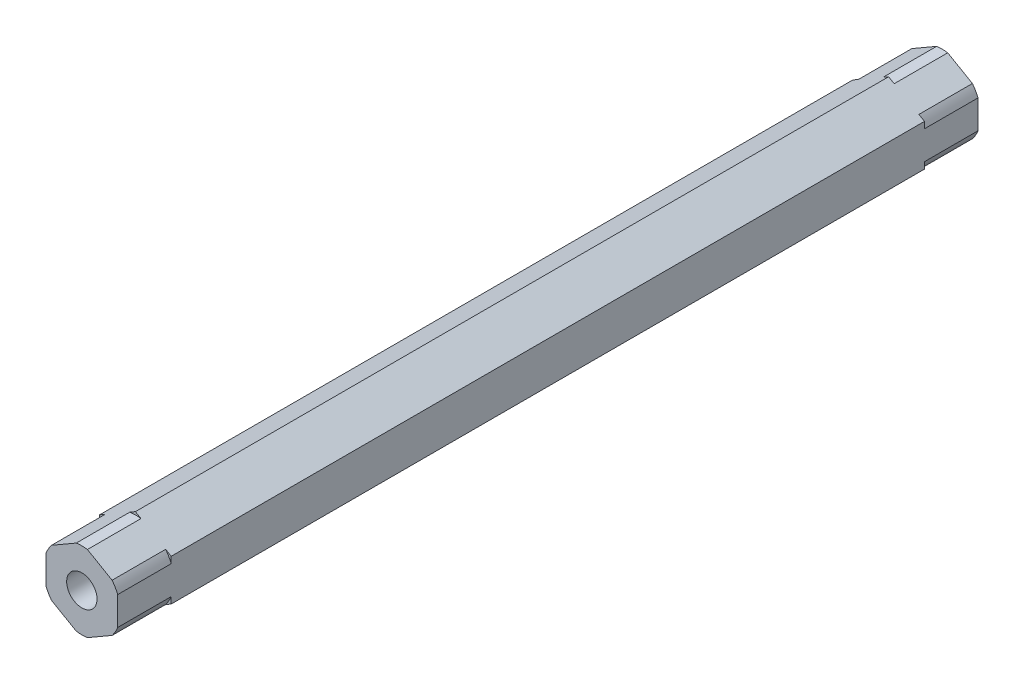
ISO-10303-21;
HEADER;
FILE_DESCRIPTION(('STEP AP214'),'2;1');
FILE_NAME('part.step','',(''),(''),'','','');
FILE_SCHEMA(('AUTOMOTIVE_DESIGN { 1 0 10303 214 1 1 1 1 }'));
ENDSEC;
DATA;
#1=APPLICATION_CONTEXT('core data for automotive mechanical design processes');
#2=APPLICATION_PROTOCOL_DEFINITION('international standard','automotive_design',2000,#1);
#3=PRODUCT_CONTEXT('',#1,'mechanical');
#4=PRODUCT('Part','Part','',(#3));
#5=PRODUCT_RELATED_PRODUCT_CATEGORY('part','',(#4));
#6=PRODUCT_DEFINITION_FORMATION('','',#4);
#7=PRODUCT_DEFINITION_CONTEXT('part definition',#1,'design');
#8=PRODUCT_DEFINITION('design','',#6,#7);
#9=PRODUCT_DEFINITION_SHAPE('','',#8);
#10=(LENGTH_UNIT() NAMED_UNIT(*) SI_UNIT(.MILLI.,.METRE.));
#11=(NAMED_UNIT(*) PLANE_ANGLE_UNIT() SI_UNIT($,.RADIAN.));
#12=(NAMED_UNIT(*) SI_UNIT($,.STERADIAN.) SOLID_ANGLE_UNIT());
#13=UNCERTAINTY_MEASURE_WITH_UNIT(LENGTH_MEASURE(1.E-05),#10,'distance_accuracy_value','');
#14=(GEOMETRIC_REPRESENTATION_CONTEXT(3) GLOBAL_UNCERTAINTY_ASSIGNED_CONTEXT((#13)) GLOBAL_UNIT_ASSIGNED_CONTEXT((#10,
#11,#12)) REPRESENTATION_CONTEXT('',''));
#15=CARTESIAN_POINT('',(0.,0.,0.));
#16=DIRECTION('',(0.,0.,1.));
#17=DIRECTION('',(1.,0.,0.));
#18=AXIS2_PLACEMENT_3D('',#15,#16,#17);
#19=CARTESIAN_POINT('',(2.38125,-4.12444598552339,57.15));
#20=DIRECTION('',(-0.500000000000001,0.866025403784438,0.));
#21=DIRECTION('',(-0.866025403784438,-0.500000000000001,0.));
#22=AXIS2_PLACEMENT_3D('',#19,#20,#21);
#23=PLANE('',#22);
#24=DIRECTION('',(-0.866025403784438,-0.500000000000001,0.));
#25=VECTOR('',#24,1.);
#26=CARTESIAN_POINT('',(2.38125,-4.12444598552339,-50.038));
#27=LINE('',#26,#25);
#28=CARTESIAN_POINT('',(4.7625,-2.74963065701559,-50.038));
#29=VERTEX_POINT('',#28);
#30=CARTESIAN_POINT('',(4.02081215572939,-3.1778443335599,-50.038));
#31=VERTEX_POINT('',#30);
#32=EDGE_CURVE('E270',#29,#31,#27,.T.);
#33=ORIENTED_EDGE('',*,*,#32,.F.);
#34=DIRECTION('',(0.,0.,-1.));
#35=VECTOR('',#34,1.);
#36=CARTESIAN_POINT('',(4.7625,-2.74963065701559,57.15));
#37=LINE('',#36,#35);
#38=CARTESIAN_POINT('',(4.7625,-2.74963065701559,50.038));
#39=VERTEX_POINT('',#38);
#40=EDGE_CURVE('E383',#39,#29,#37,.T.);
#41=ORIENTED_EDGE('',*,*,#40,.F.);
#42=DIRECTION('',(0.866025403784438,0.500000000000001,0.));
#43=VECTOR('',#42,1.);
#44=CARTESIAN_POINT('',(2.38125,-4.12444598552339,50.038));
#45=LINE('',#44,#43);
#46=CARTESIAN_POINT('',(4.02081215572939,-3.1778443335599,50.038));
#47=VERTEX_POINT('',#46);
#48=EDGE_CURVE('E311',#47,#39,#45,.T.);
#49=ORIENTED_EDGE('',*,*,#48,.F.);
#50=DIRECTION('',(0.,0.,1.));
#51=VECTOR('',#50,1.);
#52=CARTESIAN_POINT('',(4.02081215572939,-3.1778443335599,50.038));
#53=LINE('',#52,#51);
#54=CARTESIAN_POINT('',(4.02081215572939,-3.1778443335599,57.15));
#55=VERTEX_POINT('',#54);
#56=EDGE_CURVE('E304',#55,#47,#53,.F.);
#57=ORIENTED_EDGE('',*,*,#56,.F.);
#58=DIRECTION('',(0.866025403784438,0.500000000000001,0.));
#59=VECTOR('',#58,1.);
#60=CARTESIAN_POINT('',(2.38125,-4.12444598552339,57.15));
#61=LINE('',#60,#59);
#62=CARTESIAN_POINT('',(0.741687844270614,-5.07104763748687,57.15));
#63=VERTEX_POINT('',#62);
#64=EDGE_CURVE('E336',#63,#55,#61,.T.);
#65=ORIENTED_EDGE('',*,*,#64,.F.);
#66=DIRECTION('',(0.,0.,1.));
#67=VECTOR('',#66,1.);
#68=CARTESIAN_POINT('',(0.741687844270614,-5.07104763748687,50.038));
#69=LINE('',#68,#67);
#70=CARTESIAN_POINT('',(0.741687844270614,-5.07104763748687,50.038));
#71=VERTEX_POINT('',#70);
#72=EDGE_CURVE('E306',#71,#63,#69,.T.);
#73=ORIENTED_EDGE('',*,*,#72,.F.);
#74=CARTESIAN_POINT('',(0.,-5.49926131403119,50.038));
#75=VERTEX_POINT('',#74);
#76=EDGE_CURVE('E308',#75,#71,#45,.T.);
#77=ORIENTED_EDGE('',*,*,#76,.F.);
#78=DIRECTION('',(0.,0.,-1.));
#79=VECTOR('',#78,1.);
#80=CARTESIAN_POINT('',(0.,-5.49926131403119,57.15));
#81=LINE('',#80,#79);
#82=CARTESIAN_POINT('',(0.,-5.49926131403119,-50.038));
#83=VERTEX_POINT('',#82);
#84=EDGE_CURVE('E355',#75,#83,#81,.T.);
#85=ORIENTED_EDGE('',*,*,#84,.T.);
#86=CARTESIAN_POINT('',(0.741687844270614,-5.07104763748687,-50.038));
#87=VERTEX_POINT('',#86);
#88=EDGE_CURVE('E267',#87,#83,#27,.T.);
#89=ORIENTED_EDGE('',*,*,#88,.F.);
#90=DIRECTION('',(0.,0.,-1.));
#91=VECTOR('',#90,1.);
#92=CARTESIAN_POINT('',(0.741687844270614,-5.07104763748687,-50.038));
#93=LINE('',#92,#91);
#94=CARTESIAN_POINT('',(0.741687844270614,-5.07104763748687,-57.15));
#95=VERTEX_POINT('',#94);
#96=EDGE_CURVE('E254',#87,#95,#93,.T.);
#97=ORIENTED_EDGE('',*,*,#96,.T.);
#98=DIRECTION('',(0.866025403784438,0.500000000000001,0.));
#99=VECTOR('',#98,1.);
#100=CARTESIAN_POINT('',(2.38125,-4.12444598552339,-57.15));
#101=LINE('',#100,#99);
#102=CARTESIAN_POINT('',(4.02081215572939,-3.1778443335599,-57.15));
#103=VERTEX_POINT('',#102);
#104=EDGE_CURVE('E333',#95,#103,#101,.T.);
#105=ORIENTED_EDGE('',*,*,#104,.T.);
#106=DIRECTION('',(0.,0.,-1.));
#107=VECTOR('',#106,1.);
#108=CARTESIAN_POINT('',(4.02081215572939,-3.1778443335599,-50.038));
#109=LINE('',#108,#107);
#110=EDGE_CURVE('E258',#103,#31,#109,.F.);
#111=ORIENTED_EDGE('',*,*,#110,.T.);
#112=EDGE_LOOP('',(#33,#41,#49,#57,#65,#73,#77,#85,#89,#97,#105,#111));
#113=FACE_BOUND('',#112,.T.);
#114=ADVANCED_FACE('F35',(#113),#23,.F.);
#115=CARTESIAN_POINT('',(4.7625,0.,57.15));
#116=DIRECTION('',(-1.,0.,0.));
#117=DIRECTION('',(0.,-1.,0.));
#118=AXIS2_PLACEMENT_3D('',#115,#116,#117);
#119=PLANE('',#118);
#120=DIRECTION('',(0.,-1.,0.));
#121=VECTOR('',#120,1.);
#122=CARTESIAN_POINT('',(4.7625,0.,-50.038));
#123=LINE('',#122,#121);
#124=CARTESIAN_POINT('',(4.7625,2.7496306570156,-50.038));
#125=VERTEX_POINT('',#124);
#126=CARTESIAN_POINT('',(4.7625,1.89320330392698,-50.038));
#127=VERTEX_POINT('',#126);
#128=EDGE_CURVE('E232',#125,#127,#123,.T.);
#129=ORIENTED_EDGE('',*,*,#128,.F.);
#130=DIRECTION('',(0.,0.,-1.));
#131=VECTOR('',#130,1.);
#132=CARTESIAN_POINT('',(4.7625,2.7496306570156,57.15));
#133=LINE('',#132,#131);
#134=CARTESIAN_POINT('',(4.7625,2.7496306570156,50.038));
#135=VERTEX_POINT('',#134);
#136=EDGE_CURVE('E381',#135,#125,#133,.T.);
#137=ORIENTED_EDGE('',*,*,#136,.F.);
#138=DIRECTION('',(0.,1.,0.));
#139=VECTOR('',#138,1.);
#140=CARTESIAN_POINT('',(4.7625,0.,50.038));
#141=LINE('',#140,#139);
#142=CARTESIAN_POINT('',(4.7625,1.89320330392698,50.038));
#143=VERTEX_POINT('',#142);
#144=EDGE_CURVE('E320',#143,#135,#141,.T.);
#145=ORIENTED_EDGE('',*,*,#144,.F.);
#146=DIRECTION('',(0.,0.,1.));
#147=VECTOR('',#146,1.);
#148=CARTESIAN_POINT('',(4.7625,1.89320330392698,50.038));
#149=LINE('',#148,#147);
#150=CARTESIAN_POINT('',(4.7625,1.89320330392698,57.15));
#151=VERTEX_POINT('',#150);
#152=EDGE_CURVE('E300',#151,#143,#149,.F.);
#153=ORIENTED_EDGE('',*,*,#152,.F.);
#154=DIRECTION('',(0.,1.,0.));
#155=VECTOR('',#154,1.);
#156=CARTESIAN_POINT('',(4.7625,0.,57.15));
#157=LINE('',#156,#155);
#158=CARTESIAN_POINT('',(4.7625,-1.89320330392697,57.15));
#159=VERTEX_POINT('',#158);
#160=EDGE_CURVE('E339',#159,#151,#157,.T.);
#161=ORIENTED_EDGE('',*,*,#160,.F.);
#162=DIRECTION('',(0.,0.,1.));
#163=VECTOR('',#162,1.);
#164=CARTESIAN_POINT('',(4.7625,-1.89320330392697,50.038));
#165=LINE('',#164,#163);
#166=CARTESIAN_POINT('',(4.7625,-1.89320330392697,50.038));
#167=VERTEX_POINT('',#166);
#168=EDGE_CURVE('E302',#167,#159,#165,.T.);
#169=ORIENTED_EDGE('',*,*,#168,.F.);
#170=EDGE_CURVE('E322',#39,#167,#141,.T.);
#171=ORIENTED_EDGE('',*,*,#170,.F.);
#172=ORIENTED_EDGE('',*,*,#40,.T.);
#173=CARTESIAN_POINT('',(4.7625,-1.89320330392697,-50.038));
#174=VERTEX_POINT('',#173);
#175=EDGE_CURVE('E240',#174,#29,#123,.T.);
#176=ORIENTED_EDGE('',*,*,#175,.F.);
#177=DIRECTION('',(0.,0.,-1.));
#178=VECTOR('',#177,1.);
#179=CARTESIAN_POINT('',(4.7625,-1.89320330392697,-50.038));
#180=LINE('',#179,#178);
#181=CARTESIAN_POINT('',(4.7625,-1.89320330392697,-57.15));
#182=VERTEX_POINT('',#181);
#183=EDGE_CURVE('E255',#174,#182,#180,.T.);
#184=ORIENTED_EDGE('',*,*,#183,.T.);
#185=DIRECTION('',(0.,1.,0.));
#186=VECTOR('',#185,1.);
#187=CARTESIAN_POINT('',(4.7625,0.,-57.15));
#188=LINE('',#187,#186);
#189=CARTESIAN_POINT('',(4.7625,1.89320330392698,-57.15));
#190=VERTEX_POINT('',#189);
#191=EDGE_CURVE('E253',#182,#190,#188,.T.);
#192=ORIENTED_EDGE('',*,*,#191,.T.);
#193=DIRECTION('',(0.,0.,-1.));
#194=VECTOR('',#193,1.);
#195=CARTESIAN_POINT('',(4.7625,1.89320330392698,-50.038));
#196=LINE('',#195,#194);
#197=EDGE_CURVE('E49',#190,#127,#196,.F.);
#198=ORIENTED_EDGE('',*,*,#197,.T.);
#199=EDGE_LOOP('',(#129,#137,#145,#153,#161,#169,#171,#172,#176,#184,#192,#198));
#200=FACE_BOUND('',#199,.T.);
#201=ADVANCED_FACE('F250',(#200),#119,.F.);
#202=CARTESIAN_POINT('',(2.38125,4.12444598552339,57.15));
#203=DIRECTION('',(-0.5,-0.866025403784439,0.));
#204=DIRECTION('',(0.866025403784439,-0.5,0.));
#205=AXIS2_PLACEMENT_3D('',#202,#203,#204);
#206=PLANE('',#205);
#207=DIRECTION('',(0.866025403784439,-0.5,0.));
#208=VECTOR('',#207,1.);
#209=CARTESIAN_POINT('',(2.38125,4.12444598552339,-50.038));
#210=LINE('',#209,#208);
#211=CARTESIAN_POINT('',(0.,5.49926131403118,-50.038));
#212=VERTEX_POINT('',#211);
#213=CARTESIAN_POINT('',(0.741687844270607,5.07104763748687,-50.038));
#214=VERTEX_POINT('',#213);
#215=EDGE_CURVE('E274',#212,#214,#210,.T.);
#216=ORIENTED_EDGE('',*,*,#215,.F.);
#217=DIRECTION('',(0.,0.,-1.));
#218=VECTOR('',#217,1.);
#219=CARTESIAN_POINT('',(0.,5.49926131403119,57.15));
#220=LINE('',#219,#218);
#221=CARTESIAN_POINT('',(0.,5.49926131403118,50.038));
#222=VERTEX_POINT('',#221);
#223=EDGE_CURVE('E378',#222,#212,#220,.T.);
#224=ORIENTED_EDGE('',*,*,#223,.F.);
#225=DIRECTION('',(-0.866025403784439,0.5,0.));
#226=VECTOR('',#225,1.);
#227=CARTESIAN_POINT('',(2.38125,4.12444598552339,50.038));
#228=LINE('',#227,#226);
#229=CARTESIAN_POINT('',(0.741687844270607,5.07104763748687,50.038));
#230=VERTEX_POINT('',#229);
#231=EDGE_CURVE('E317',#230,#222,#228,.T.);
#232=ORIENTED_EDGE('',*,*,#231,.F.);
#233=DIRECTION('',(0.,0.,1.));
#234=VECTOR('',#233,1.);
#235=CARTESIAN_POINT('',(0.741687844270607,5.07104763748687,50.038));
#236=LINE('',#235,#234);
#237=CARTESIAN_POINT('',(0.741687844270609,5.07104763748687,57.15));
#238=VERTEX_POINT('',#237);
#239=EDGE_CURVE('E296',#238,#230,#236,.F.);
#240=ORIENTED_EDGE('',*,*,#239,.F.);
#241=DIRECTION('',(-0.866025403784439,0.5,0.));
#242=VECTOR('',#241,1.);
#243=CARTESIAN_POINT('',(2.38125,4.12444598552339,57.15));
#244=LINE('',#243,#242);
#245=CARTESIAN_POINT('',(4.02081215572939,3.17784433355991,57.15));
#246=VERTEX_POINT('',#245);
#247=EDGE_CURVE('E343',#246,#238,#244,.T.);
#248=ORIENTED_EDGE('',*,*,#247,.F.);
#249=DIRECTION('',(0.,0.,1.));
#250=VECTOR('',#249,1.);
#251=CARTESIAN_POINT('',(4.02081215572939,3.1778443335599,50.038));
#252=LINE('',#251,#250);
#253=CARTESIAN_POINT('',(4.02081215572939,3.1778443335599,50.038));
#254=VERTEX_POINT('',#253);
#255=EDGE_CURVE('E298',#254,#246,#252,.T.);
#256=ORIENTED_EDGE('',*,*,#255,.F.);
#257=EDGE_CURVE('E319',#135,#254,#228,.T.);
#258=ORIENTED_EDGE('',*,*,#257,.F.);
#259=ORIENTED_EDGE('',*,*,#136,.T.);
#260=CARTESIAN_POINT('',(4.02081215572939,3.1778443335599,-50.038));
#261=VERTEX_POINT('',#260);
#262=EDGE_CURVE('E236',#261,#125,#210,.T.);
#263=ORIENTED_EDGE('',*,*,#262,.F.);
#264=DIRECTION('',(0.,0.,-1.));
#265=VECTOR('',#264,1.);
#266=CARTESIAN_POINT('',(4.02081215572939,3.1778443335599,-50.038));
#267=LINE('',#266,#265);
#268=CARTESIAN_POINT('',(4.02081215572939,3.17784433355991,-57.15));
#269=VERTEX_POINT('',#268);
#270=EDGE_CURVE('E244',#261,#269,#267,.T.);
#271=ORIENTED_EDGE('',*,*,#270,.T.);
#272=DIRECTION('',(-0.866025403784439,0.5,0.));
#273=VECTOR('',#272,1.);
#274=CARTESIAN_POINT('',(2.38125,4.12444598552339,-57.15));
#275=LINE('',#274,#273);
#276=CARTESIAN_POINT('',(0.741687844270609,5.07104763748687,-57.15));
#277=VERTEX_POINT('',#276);
#278=EDGE_CURVE('E359',#269,#277,#275,.T.);
#279=ORIENTED_EDGE('',*,*,#278,.T.);
#280=DIRECTION('',(0.,0.,-1.));
#281=VECTOR('',#280,1.);
#282=CARTESIAN_POINT('',(0.741687844270607,5.07104763748687,-50.038));
#283=LINE('',#282,#281);
#284=EDGE_CURVE('E57',#277,#214,#283,.F.);
#285=ORIENTED_EDGE('',*,*,#284,.T.);
#286=EDGE_LOOP('',(#216,#224,#232,#240,#248,#256,#258,#259,#263,#271,#279,#285));
#287=FACE_BOUND('',#286,.T.);
#288=ADVANCED_FACE('F464',(#287),#206,.F.);
#289=CARTESIAN_POINT('',(-2.38125,4.12444598552339,57.15));
#290=DIRECTION('',(0.5,-0.866025403784438,0.));
#291=DIRECTION('',(0.866025403784439,0.5,0.));
#292=AXIS2_PLACEMENT_3D('',#289,#290,#291);
#293=PLANE('',#292);
#294=DIRECTION('',(0.866025403784439,0.5,0.));
#295=VECTOR('',#294,1.);
#296=CARTESIAN_POINT('',(-2.38125,4.12444598552339,-50.038));
#297=LINE('',#296,#295);
#298=CARTESIAN_POINT('',(-4.7625,2.74963065701559,-50.038));
#299=VERTEX_POINT('',#298);
#300=CARTESIAN_POINT('',(-4.02081215572939,3.1778443335599,-50.038));
#301=VERTEX_POINT('',#300);
#302=EDGE_CURVE('E271',#299,#301,#297,.T.);
#303=ORIENTED_EDGE('',*,*,#302,.F.);
#304=DIRECTION('',(0.,0.,-1.));
#305=VECTOR('',#304,1.);
#306=CARTESIAN_POINT('',(-4.7625,2.74963065701559,57.15));
#307=LINE('',#306,#305);
#308=CARTESIAN_POINT('',(-4.7625,2.74963065701559,50.038));
#309=VERTEX_POINT('',#308);
#310=EDGE_CURVE('E375',#309,#299,#307,.T.);
#311=ORIENTED_EDGE('',*,*,#310,.F.);
#312=DIRECTION('',(-0.866025403784439,-0.5,0.));
#313=VECTOR('',#312,1.);
#314=CARTESIAN_POINT('',(-2.38125,4.12444598552339,50.038));
#315=LINE('',#314,#313);
#316=CARTESIAN_POINT('',(-4.02081215572939,3.1778443335599,50.038));
#317=VERTEX_POINT('',#316);
#318=EDGE_CURVE('E314',#317,#309,#315,.T.);
#319=ORIENTED_EDGE('',*,*,#318,.F.);
#320=DIRECTION('',(0.,0.,1.));
#321=VECTOR('',#320,1.);
#322=CARTESIAN_POINT('',(-4.02081215572939,3.1778443335599,50.038));
#323=LINE('',#322,#321);
#324=CARTESIAN_POINT('',(-4.02081215572939,3.1778443335599,57.15));
#325=VERTEX_POINT('',#324);
#326=EDGE_CURVE('E292',#325,#317,#323,.F.);
#327=ORIENTED_EDGE('',*,*,#326,.F.);
#328=DIRECTION('',(-0.866025403784438,-0.5,0.));
#329=VECTOR('',#328,1.);
#330=CARTESIAN_POINT('',(-2.38125,4.12444598552339,57.15));
#331=LINE('',#330,#329);
#332=CARTESIAN_POINT('',(-0.741687844270611,5.07104763748687,57.15));
#333=VERTEX_POINT('',#332);
#334=EDGE_CURVE('E346',#333,#325,#331,.T.);
#335=ORIENTED_EDGE('',*,*,#334,.F.);
#336=DIRECTION('',(0.,0.,1.));
#337=VECTOR('',#336,1.);
#338=CARTESIAN_POINT('',(-0.741687844270608,5.07104763748687,50.038));
#339=LINE('',#338,#337);
#340=CARTESIAN_POINT('',(-0.741687844270608,5.07104763748687,50.038));
#341=VERTEX_POINT('',#340);
#342=EDGE_CURVE('E294',#341,#333,#339,.T.);
#343=ORIENTED_EDGE('',*,*,#342,.F.);
#344=EDGE_CURVE('E316',#222,#341,#315,.T.);
#345=ORIENTED_EDGE('',*,*,#344,.F.);
#346=ORIENTED_EDGE('',*,*,#223,.T.);
#347=CARTESIAN_POINT('',(-0.741687844270608,5.07104763748687,-50.038));
#348=VERTEX_POINT('',#347);
#349=EDGE_CURVE('E273',#348,#212,#297,.T.);
#350=ORIENTED_EDGE('',*,*,#349,.F.);
#351=DIRECTION('',(0.,0.,-1.));
#352=VECTOR('',#351,1.);
#353=CARTESIAN_POINT('',(-0.741687844270608,5.07104763748687,-50.038));
#354=LINE('',#353,#352);
#355=CARTESIAN_POINT('',(-0.741687844270611,5.07104763748687,-57.15));
#356=VERTEX_POINT('',#355);
#357=EDGE_CURVE('E467',#348,#356,#354,.T.);
#358=ORIENTED_EDGE('',*,*,#357,.T.);
#359=DIRECTION('',(-0.866025403784438,-0.5,0.));
#360=VECTOR('',#359,1.);
#361=CARTESIAN_POINT('',(-2.38125,4.12444598552339,-57.15));
#362=LINE('',#361,#360);
#363=CARTESIAN_POINT('',(-4.02081215572939,3.1778443335599,-57.15));
#364=VERTEX_POINT('',#363);
#365=EDGE_CURVE('E362',#356,#364,#362,.T.);
#366=ORIENTED_EDGE('',*,*,#365,.T.);
#367=DIRECTION('',(0.,0.,-1.));
#368=VECTOR('',#367,1.);
#369=CARTESIAN_POINT('',(-4.02081215572939,3.1778443335599,-50.038));
#370=LINE('',#369,#368);
#371=EDGE_CURVE('E489',#364,#301,#370,.F.);
#372=ORIENTED_EDGE('',*,*,#371,.T.);
#373=EDGE_LOOP('',(#303,#311,#319,#327,#335,#343,#345,#346,#350,#358,#366,#372));
#374=FACE_BOUND('',#373,.T.);
#375=ADVANCED_FACE('F443',(#374),#293,.F.);
#376=CARTESIAN_POINT('',(-4.7625,0.,57.15));
#377=DIRECTION('',(1.,0.,0.));
#378=DIRECTION('',(0.,1.,0.));
#379=AXIS2_PLACEMENT_3D('',#376,#377,#378);
#380=PLANE('',#379);
#381=DIRECTION('',(0.,1.,0.));
#382=VECTOR('',#381,1.);
#383=CARTESIAN_POINT('',(-4.7625,0.,-50.038));
#384=LINE('',#383,#382);
#385=CARTESIAN_POINT('',(-4.7625,-2.7496306570156,-50.038));
#386=VERTEX_POINT('',#385);
#387=CARTESIAN_POINT('',(-4.7625,-1.89320330392697,-50.038));
#388=VERTEX_POINT('',#387);
#389=EDGE_CURVE('E265',#386,#388,#384,.T.);
#390=ORIENTED_EDGE('',*,*,#389,.F.);
#391=DIRECTION('',(0.,0.,-1.));
#392=VECTOR('',#391,1.);
#393=CARTESIAN_POINT('',(-4.7625,-2.7496306570156,57.15));
#394=LINE('',#393,#392);
#395=CARTESIAN_POINT('',(-4.7625,-2.7496306570156,50.038));
#396=VERTEX_POINT('',#395);
#397=EDGE_CURVE('E372',#396,#386,#394,.T.);
#398=ORIENTED_EDGE('',*,*,#397,.F.);
#399=DIRECTION('',(0.,-1.,0.));
#400=VECTOR('',#399,1.);
#401=CARTESIAN_POINT('',(-4.7625,0.,50.038));
#402=LINE('',#401,#400);
#403=CARTESIAN_POINT('',(-4.7625,-1.89320330392697,50.038));
#404=VERTEX_POINT('',#403);
#405=EDGE_CURVE('E310',#404,#396,#402,.T.);
#406=ORIENTED_EDGE('',*,*,#405,.F.);
#407=DIRECTION('',(0.,0.,1.));
#408=VECTOR('',#407,1.);
#409=CARTESIAN_POINT('',(-4.7625,-1.89320330392697,50.038));
#410=LINE('',#409,#408);
#411=CARTESIAN_POINT('',(-4.7625,-1.89320330392697,57.15));
#412=VERTEX_POINT('',#411);
#413=EDGE_CURVE('E288',#412,#404,#410,.F.);
#414=ORIENTED_EDGE('',*,*,#413,.F.);
#415=DIRECTION('',(0.,-1.,0.));
#416=VECTOR('',#415,1.);
#417=CARTESIAN_POINT('',(-4.7625,0.,57.15));
#418=LINE('',#417,#416);
#419=CARTESIAN_POINT('',(-4.7625,1.89320330392697,57.15));
#420=VERTEX_POINT('',#419);
#421=EDGE_CURVE('E349',#420,#412,#418,.T.);
#422=ORIENTED_EDGE('',*,*,#421,.F.);
#423=DIRECTION('',(0.,0.,1.));
#424=VECTOR('',#423,1.);
#425=CARTESIAN_POINT('',(-4.7625,1.89320330392697,50.038));
#426=LINE('',#425,#424);
#427=CARTESIAN_POINT('',(-4.7625,1.89320330392697,50.038));
#428=VERTEX_POINT('',#427);
#429=EDGE_CURVE('E290',#428,#420,#426,.T.);
#430=ORIENTED_EDGE('',*,*,#429,.F.);
#431=EDGE_CURVE('E313',#309,#428,#402,.T.);
#432=ORIENTED_EDGE('',*,*,#431,.F.);
#433=ORIENTED_EDGE('',*,*,#310,.T.);
#434=CARTESIAN_POINT('',(-4.7625,1.89320330392697,-50.038));
#435=VERTEX_POINT('',#434);
#436=EDGE_CURVE('E268',#435,#299,#384,.T.);
#437=ORIENTED_EDGE('',*,*,#436,.F.);
#438=DIRECTION('',(0.,0.,-1.));
#439=VECTOR('',#438,1.);
#440=CARTESIAN_POINT('',(-4.7625,1.89320330392697,-50.038));
#441=LINE('',#440,#439);
#442=CARTESIAN_POINT('',(-4.7625,1.89320330392697,-57.15));
#443=VERTEX_POINT('',#442);
#444=EDGE_CURVE('E482',#435,#443,#441,.T.);
#445=ORIENTED_EDGE('',*,*,#444,.T.);
#446=DIRECTION('',(0.,-1.,0.));
#447=VECTOR('',#446,1.);
#448=CARTESIAN_POINT('',(-4.7625,0.,-57.15));
#449=LINE('',#448,#447);
#450=CARTESIAN_POINT('',(-4.7625,-1.89320330392697,-57.15));
#451=VERTEX_POINT('',#450);
#452=EDGE_CURVE('E365',#443,#451,#449,.T.);
#453=ORIENTED_EDGE('',*,*,#452,.T.);
#454=DIRECTION('',(0.,0.,-1.));
#455=VECTOR('',#454,1.);
#456=CARTESIAN_POINT('',(-4.7625,-1.89320330392697,-50.038));
#457=LINE('',#456,#455);
#458=EDGE_CURVE('E485',#451,#388,#457,.F.);
#459=ORIENTED_EDGE('',*,*,#458,.T.);
#460=EDGE_LOOP('',(#390,#398,#406,#414,#422,#430,#432,#433,#437,#445,#453,#459));
#461=FACE_BOUND('',#460,.T.);
#462=ADVANCED_FACE('F503',(#461),#380,.F.);
#463=CARTESIAN_POINT('',(-2.38125,-4.12444598552339,57.15));
#464=DIRECTION('',(0.5,0.866025403784439,0.));
#465=DIRECTION('',(-0.866025403784439,0.5,0.));
#466=AXIS2_PLACEMENT_3D('',#463,#464,#465);
#467=PLANE('',#466);
#468=DIRECTION('',(-0.866025403784439,0.5,0.));
#469=VECTOR('',#468,1.);
#470=CARTESIAN_POINT('',(-2.38125,-4.12444598552339,-50.038));
#471=LINE('',#470,#469);
#472=CARTESIAN_POINT('',(-0.741687844270613,-5.07104763748687,-50.038));
#473=VERTEX_POINT('',#472);
#474=EDGE_CURVE('E11',#83,#473,#471,.T.);
#475=ORIENTED_EDGE('',*,*,#474,.F.);
#476=ORIENTED_EDGE('',*,*,#84,.F.);
#477=DIRECTION('',(0.866025403784439,-0.5,0.));
#478=VECTOR('',#477,1.);
#479=CARTESIAN_POINT('',(-2.38125,-4.12444598552339,50.038));
#480=LINE('',#479,#478);
#481=CARTESIAN_POINT('',(-0.741687844270613,-5.07104763748687,50.038));
#482=VERTEX_POINT('',#481);
#483=EDGE_CURVE('E391',#482,#75,#480,.T.);
#484=ORIENTED_EDGE('',*,*,#483,.F.);
#485=DIRECTION('',(0.,0.,1.));
#486=VECTOR('',#485,1.);
#487=CARTESIAN_POINT('',(-0.741687844270613,-5.07104763748687,50.038));
#488=LINE('',#487,#486);
#489=CARTESIAN_POINT('',(-0.741687844270615,-5.07104763748687,57.15));
#490=VERTEX_POINT('',#489);
#491=EDGE_CURVE('E279',#490,#482,#488,.F.);
#492=ORIENTED_EDGE('',*,*,#491,.F.);
#493=DIRECTION('',(0.866025403784439,-0.5,0.));
#494=VECTOR('',#493,1.);
#495=CARTESIAN_POINT('',(-2.38125,-4.12444598552339,57.15));
#496=LINE('',#495,#494);
#497=CARTESIAN_POINT('',(-4.02081215572938,-3.17784433355991,57.15));
#498=VERTEX_POINT('',#497);
#499=EDGE_CURVE('E352',#498,#490,#496,.T.);
#500=ORIENTED_EDGE('',*,*,#499,.F.);
#501=DIRECTION('',(0.,0.,1.));
#502=VECTOR('',#501,1.);
#503=CARTESIAN_POINT('',(-4.02081215572938,-3.17784433355991,50.038));
#504=LINE('',#503,#502);
#505=CARTESIAN_POINT('',(-4.02081215572938,-3.17784433355991,50.038));
#506=VERTEX_POINT('',#505);
#507=EDGE_CURVE('E286',#506,#498,#504,.T.);
#508=ORIENTED_EDGE('',*,*,#507,.F.);
#509=EDGE_CURVE('E392',#396,#506,#480,.T.);
#510=ORIENTED_EDGE('',*,*,#509,.F.);
#511=ORIENTED_EDGE('',*,*,#397,.T.);
#512=CARTESIAN_POINT('',(-4.02081215572938,-3.17784433355991,-50.038));
#513=VERTEX_POINT('',#512);
#514=EDGE_CURVE('E38',#513,#386,#471,.T.);
#515=ORIENTED_EDGE('',*,*,#514,.F.);
#516=DIRECTION('',(0.,0.,-1.));
#517=VECTOR('',#516,1.);
#518=CARTESIAN_POINT('',(-4.02081215572938,-3.17784433355991,-50.038));
#519=LINE('',#518,#517);
#520=CARTESIAN_POINT('',(-4.02081215572938,-3.17784433355991,-57.15));
#521=VERTEX_POINT('',#520);
#522=EDGE_CURVE('E245',#513,#521,#519,.T.);
#523=ORIENTED_EDGE('',*,*,#522,.T.);
#524=DIRECTION('',(0.866025403784439,-0.5,0.));
#525=VECTOR('',#524,1.);
#526=CARTESIAN_POINT('',(-2.38125,-4.12444598552339,-57.15));
#527=LINE('',#526,#525);
#528=CARTESIAN_POINT('',(-0.741687844270615,-5.07104763748687,-57.15));
#529=VERTEX_POINT('',#528);
#530=EDGE_CURVE('E340',#521,#529,#527,.T.);
#531=ORIENTED_EDGE('',*,*,#530,.T.);
#532=DIRECTION('',(0.,0.,-1.));
#533=VECTOR('',#532,1.);
#534=CARTESIAN_POINT('',(-0.741687844270613,-5.07104763748687,-50.038));
#535=LINE('',#534,#533);
#536=EDGE_CURVE('E479',#529,#473,#535,.F.);
#537=ORIENTED_EDGE('',*,*,#536,.T.);
#538=EDGE_LOOP('',(#475,#476,#484,#492,#500,#508,#510,#511,#515,#523,#531,#537));
#539=FACE_BOUND('',#538,.T.);
#540=ADVANCED_FACE('F423',(#539),#467,.F.);
#541=CARTESIAN_POINT('',(0.,0.,-57.15));
#542=DIRECTION('',(0.,0.,1.));
#543=DIRECTION('',(1.,0.,0.));
#544=AXIS2_PLACEMENT_3D('',#541,#542,#543);
#545=PLANE('',#544);
#546=CARTESIAN_POINT('',(0.,0.,-57.15));
#547=DIRECTION('',(0.,0.,-1.));
#548=DIRECTION('',(-1.,0.,0.));
#549=AXIS2_PLACEMENT_3D('',#546,#547,#548);
#550=CIRCLE('',#549,2.0193);
#551=CARTESIAN_POINT('',(-2.0193,0.,-57.15));
#552=VERTEX_POINT('',#551);
#553=EDGE_CURVE('E326',#552,#552,#550,.T.);
#554=ORIENTED_EDGE('',*,*,#553,.F.);
#555=EDGE_LOOP('',(#554));
#556=FACE_BOUND('',#555,.T.);
#557=ORIENTED_EDGE('',*,*,#191,.F.);
#558=CARTESIAN_POINT('',(0.,0.,-57.15));
#559=DIRECTION('',(0.,0.,1.));
#560=DIRECTION('',(1.,0.,0.));
#561=AXIS2_PLACEMENT_3D('',#558,#559,#560);
#562=CIRCLE('',#561,5.125);
#563=EDGE_CURVE('E393',#182,#103,#562,.F.);
#564=ORIENTED_EDGE('',*,*,#563,.T.);
#565=ORIENTED_EDGE('',*,*,#104,.F.);
#566=EDGE_CURVE('E395',#95,#529,#562,.F.);
#567=ORIENTED_EDGE('',*,*,#566,.T.);
#568=ORIENTED_EDGE('',*,*,#530,.F.);
#569=EDGE_CURVE('E400',#521,#451,#562,.F.);
#570=ORIENTED_EDGE('',*,*,#569,.T.);
#571=ORIENTED_EDGE('',*,*,#452,.F.);
#572=EDGE_CURVE('E401',#443,#364,#562,.F.);
#573=ORIENTED_EDGE('',*,*,#572,.T.);
#574=ORIENTED_EDGE('',*,*,#365,.F.);
#575=EDGE_CURVE('E396',#356,#277,#562,.F.);
#576=ORIENTED_EDGE('',*,*,#575,.T.);
#577=ORIENTED_EDGE('',*,*,#278,.F.);
#578=CARTESIAN_POINT('',(0.,0.,-57.15));
#579=DIRECTION('',(0.,0.,1.));
#580=DIRECTION('',(1.,0.,0.));
#581=AXIS2_PLACEMENT_3D('',#578,#579,#580);
#582=CIRCLE('',#581,5.125);
#583=EDGE_CURVE('E475',#190,#269,#582,.T.);
#584=ORIENTED_EDGE('',*,*,#583,.F.);
#585=EDGE_LOOP('',(#557,#564,#565,#567,#568,#570,#571,#573,#574,#576,#577,#584));
#586=FACE_BOUND('',#585,.T.);
#587=ADVANCED_FACE('F492',(#556,#586),#545,.F.);
#588=CARTESIAN_POINT('',(0.,0.,57.15));
#589=DIRECTION('',(0.,0.,1.));
#590=DIRECTION('',(1.,0.,0.));
#591=AXIS2_PLACEMENT_3D('',#588,#589,#590);
#592=PLANE('',#591);
#593=CARTESIAN_POINT('',(0.,0.,57.15));
#594=DIRECTION('',(0.,0.,-1.));
#595=DIRECTION('',(-1.,0.,0.));
#596=AXIS2_PLACEMENT_3D('',#593,#594,#595);
#597=CIRCLE('',#596,2.0193);
#598=CARTESIAN_POINT('',(2.0193,0.,57.15));
#599=VERTEX_POINT('',#598);
#600=EDGE_CURVE('E327',#599,#599,#597,.T.);
#601=ORIENTED_EDGE('',*,*,#600,.T.);
#602=EDGE_LOOP('',(#601));
#603=FACE_BOUND('',#602,.T.);
#604=ORIENTED_EDGE('',*,*,#160,.T.);
#605=CARTESIAN_POINT('',(0.,0.,57.15));
#606=DIRECTION('',(0.,0.,1.));
#607=DIRECTION('',(1.,0.,0.));
#608=AXIS2_PLACEMENT_3D('',#605,#606,#607);
#609=CIRCLE('',#608,5.125);
#610=EDGE_CURVE('E282',#151,#246,#609,.T.);
#611=ORIENTED_EDGE('',*,*,#610,.T.);
#612=ORIENTED_EDGE('',*,*,#247,.T.);
#613=CARTESIAN_POINT('',(0.,0.,57.15));
#614=DIRECTION('',(0.,0.,1.));
#615=DIRECTION('',(1.,0.,0.));
#616=AXIS2_PLACEMENT_3D('',#613,#614,#615);
#617=CIRCLE('',#616,5.125);
#618=EDGE_CURVE('E390',#238,#333,#617,.T.);
#619=ORIENTED_EDGE('',*,*,#618,.T.);
#620=ORIENTED_EDGE('',*,*,#334,.T.);
#621=EDGE_CURVE('E433',#325,#420,#617,.T.);
#622=ORIENTED_EDGE('',*,*,#621,.T.);
#623=ORIENTED_EDGE('',*,*,#421,.T.);
#624=EDGE_CURVE('E430',#412,#498,#617,.T.);
#625=ORIENTED_EDGE('',*,*,#624,.T.);
#626=ORIENTED_EDGE('',*,*,#499,.T.);
#627=EDGE_CURVE('E389',#490,#63,#617,.T.);
#628=ORIENTED_EDGE('',*,*,#627,.T.);
#629=ORIENTED_EDGE('',*,*,#64,.T.);
#630=EDGE_CURVE('E386',#55,#159,#617,.T.);
#631=ORIENTED_EDGE('',*,*,#630,.T.);
#632=EDGE_LOOP('',(#604,#611,#612,#619,#620,#622,#623,#625,#626,#628,#629,#631));
#633=FACE_BOUND('',#632,.T.);
#634=ADVANCED_FACE('F428',(#603,#633),#592,.T.);
#635=CARTESIAN_POINT('',(0.,0.,-38.1));
#636=DIRECTION('',(0.,0.,-1.));
#637=DIRECTION('',(-1.,0.,0.));
#638=AXIS2_PLACEMENT_3D('',#635,#636,#637);
#639=CYLINDRICAL_SURFACE('',#638,2.0193);
#640=CARTESIAN_POINT('',(0.,0.,-38.1));
#641=DIRECTION('',(0.,0.,-1.));
#642=DIRECTION('',(-1.,0.,0.));
#643=AXIS2_PLACEMENT_3D('',#640,#641,#642);
#644=CIRCLE('',#643,2.0193);
#645=CARTESIAN_POINT('',(-2.0193,0.,-38.1));
#646=VERTEX_POINT('',#645);
#647=EDGE_CURVE('E330',#646,#646,#644,.T.);
#648=CARTESIAN_POINT('',(-2.0193,0.,-38.1));
#649=CARTESIAN_POINT('',(-2.0193,0.,-38.2984375));
#650=CARTESIAN_POINT('',(-2.0193,0.,-38.496875));
#651=CARTESIAN_POINT('',(-2.0193,0.,-38.89375));
#652=CARTESIAN_POINT('',(-2.0193,0.,-39.0921875));
#653=CARTESIAN_POINT('',(-2.0193,0.,-39.4890625));
#654=CARTESIAN_POINT('',(-2.0193,0.,-39.6875));
#655=CARTESIAN_POINT('',(-2.0193,0.,-40.084375));
#656=CARTESIAN_POINT('',(-2.0193,0.,-40.2828125));
#657=CARTESIAN_POINT('',(-2.0193,0.,-40.6796875));
#658=CARTESIAN_POINT('',(-2.0193,0.,-40.878125));
#659=CARTESIAN_POINT('',(-2.0193,0.,-41.275));
#660=CARTESIAN_POINT('',(-2.0193,0.,-41.4734375));
#661=CARTESIAN_POINT('',(-2.0193,0.,-41.8703125));
#662=CARTESIAN_POINT('',(-2.0193,0.,-42.06875));
#663=CARTESIAN_POINT('',(-2.0193,0.,-42.465625));
#664=CARTESIAN_POINT('',(-2.0193,0.,-42.6640625));
#665=CARTESIAN_POINT('',(-2.0193,0.,-43.0609375));
#666=CARTESIAN_POINT('',(-2.0193,0.,-43.259375));
#667=CARTESIAN_POINT('',(-2.0193,0.,-43.65625));
#668=CARTESIAN_POINT('',(-2.0193,0.,-43.8546875));
#669=CARTESIAN_POINT('',(-2.0193,0.,-44.2515625));
#670=CARTESIAN_POINT('',(-2.0193,0.,-44.45));
#671=CARTESIAN_POINT('',(-2.0193,0.,-44.846875));
#672=CARTESIAN_POINT('',(-2.0193,0.,-45.0453125));
#673=CARTESIAN_POINT('',(-2.0193,0.,-45.4421875));
#674=CARTESIAN_POINT('',(-2.0193,0.,-45.640625));
#675=CARTESIAN_POINT('',(-2.0193,0.,-46.0375));
#676=CARTESIAN_POINT('',(-2.0193,0.,-46.2359375));
#677=CARTESIAN_POINT('',(-2.0193,0.,-46.6328125));
#678=CARTESIAN_POINT('',(-2.0193,0.,-46.83125));
#679=CARTESIAN_POINT('',(-2.0193,0.,-47.228125));
#680=CARTESIAN_POINT('',(-2.0193,0.,-47.4265625));
#681=CARTESIAN_POINT('',(-2.0193,0.,-47.8234375));
#682=CARTESIAN_POINT('',(-2.0193,0.,-48.021875));
#683=CARTESIAN_POINT('',(-2.0193,0.,-48.41875));
#684=CARTESIAN_POINT('',(-2.0193,0.,-48.6171875));
#685=CARTESIAN_POINT('',(-2.0193,0.,-49.0140625));
#686=CARTESIAN_POINT('',(-2.0193,0.,-49.2125));
#687=CARTESIAN_POINT('',(-2.0193,0.,-49.609375));
#688=CARTESIAN_POINT('',(-2.0193,0.,-49.8078125));
#689=CARTESIAN_POINT('',(-2.0193,0.,-50.2046875));
#690=CARTESIAN_POINT('',(-2.0193,0.,-50.403125));
#691=CARTESIAN_POINT('',(-2.0193,0.,-50.8));
#692=CARTESIAN_POINT('',(-2.0193,0.,-50.9984375));
#693=CARTESIAN_POINT('',(-2.0193,0.,-51.3953125));
#694=CARTESIAN_POINT('',(-2.0193,0.,-51.59375));
#695=CARTESIAN_POINT('',(-2.0193,0.,-51.990625));
#696=CARTESIAN_POINT('',(-2.0193,0.,-52.1890625));
#697=CARTESIAN_POINT('',(-2.0193,0.,-52.5859375));
#698=CARTESIAN_POINT('',(-2.0193,0.,-52.784375));
#699=CARTESIAN_POINT('',(-2.0193,0.,-53.18125));
#700=CARTESIAN_POINT('',(-2.0193,0.,-53.3796875));
#701=CARTESIAN_POINT('',(-2.0193,0.,-53.7765625));
#702=CARTESIAN_POINT('',(-2.0193,0.,-53.975));
#703=CARTESIAN_POINT('',(-2.0193,0.,-54.371875));
#704=CARTESIAN_POINT('',(-2.0193,0.,-54.5703125));
#705=CARTESIAN_POINT('',(-2.0193,0.,-54.9671875));
#706=CARTESIAN_POINT('',(-2.0193,0.,-55.165625));
#707=CARTESIAN_POINT('',(-2.0193,0.,-55.5625));
#708=CARTESIAN_POINT('',(-2.0193,0.,-55.7609375));
#709=CARTESIAN_POINT('',(-2.0193,0.,-56.1578125));
#710=CARTESIAN_POINT('',(-2.0193,0.,-56.35625));
#711=CARTESIAN_POINT('',(-2.0193,0.,-56.753125));
#712=CARTESIAN_POINT('',(-2.0193,0.,-56.9515625));
#713=CARTESIAN_POINT('',(-2.0193,0.,-57.15));
#714=B_SPLINE_CURVE_WITH_KNOTS('',3,(#648,#649,#650,#651,#652,#653,#654,#655,#656,#657,#658,
#659,#660,#661,#662,#663,#664,#665,#666,#667,#668,#669,#670,#671,#672,#673,#674,#675,#676,#677,
#678,#679,#680,#681,#682,#683,#684,#685,#686,#687,#688,#689,#690,#691,#692,#693,#694,#695,#696,
#697,#698,#699,#700,#701,#702,#703,#704,#705,#706,#707,#708,#709,#710,#711,#712,#713),
.UNSPECIFIED.,.F.,.F.,(4,2,2,2,2,2,2,2,2,2,2,2,2,2,2,2,2,2,2,2,2,2,2,2,2,2,2,2,2,2,2,2,4),(0.,
0.5953125,1.190625,1.7859375,2.38125,2.9765625,3.571875,4.1671875,4.7625,5.3578125,5.953125,
6.5484375,7.14375,7.7390625,8.334375,8.92968750000001,9.52500000000001,10.1203125,10.715625,
11.3109375,11.90625,12.5015625,13.096875,13.6921875,14.2875,14.8828125,15.478125,16.0734375,
16.66875,17.2640625,17.859375,18.4546875,19.05),.UNSPECIFIED.);
#715=EDGE_CURVE('BSEAM500',#646,#552,#714,.T.);
#716=ORIENTED_EDGE('',*,*,#647,.F.);
#717=ORIENTED_EDGE('',*,*,#553,.T.);
#718=ORIENTED_EDGE('',*,*,#715,.T.);
#719=ORIENTED_EDGE('',*,*,#715,.F.);
#720=EDGE_LOOP('',(#716,#718,#717,#719));
#721=FACE_BOUND('',#720,.T.);
#722=ADVANCED_FACE('F500',(#721),#639,.F.);
#723=CARTESIAN_POINT('',(0.,0.,-38.1));
#724=DIRECTION('',(0.,0.,-1.));
#725=DIRECTION('',(-1.,0.,0.));
#726=AXIS2_PLACEMENT_3D('',#723,#724,#725);
#727=PLANE('',#726);
#728=ORIENTED_EDGE('',*,*,#647,.T.);
#729=EDGE_LOOP('',(#728));
#730=FACE_BOUND('',#729,.T.);
#731=ADVANCED_FACE('F796',(#730),#727,.T.);
#732=CARTESIAN_POINT('',(0.,0.,38.1));
#733=DIRECTION('',(0.,0.,1.));
#734=DIRECTION('',(1.,0.,0.));
#735=AXIS2_PLACEMENT_3D('',#732,#733,#734);
#736=CYLINDRICAL_SURFACE('',#735,2.0193);
#737=CARTESIAN_POINT('',(0.,0.,38.1));
#738=DIRECTION('',(0.,0.,-1.));
#739=DIRECTION('',(-1.,0.,0.));
#740=AXIS2_PLACEMENT_3D('',#737,#738,#739);
#741=CIRCLE('',#740,2.0193);
#742=CARTESIAN_POINT('',(2.0193,0.,38.1));
#743=VERTEX_POINT('',#742);
#744=EDGE_CURVE('E323',#743,#743,#741,.T.);
#745=CARTESIAN_POINT('',(2.0193,0.,38.1));
#746=CARTESIAN_POINT('',(2.0193,0.,38.2984375));
#747=CARTESIAN_POINT('',(2.0193,0.,38.496875));
#748=CARTESIAN_POINT('',(2.0193,0.,38.89375));
#749=CARTESIAN_POINT('',(2.0193,0.,39.0921875));
#750=CARTESIAN_POINT('',(2.0193,0.,39.4890625));
#751=CARTESIAN_POINT('',(2.0193,0.,39.6875));
#752=CARTESIAN_POINT('',(2.0193,0.,40.084375));
#753=CARTESIAN_POINT('',(2.0193,0.,40.2828125));
#754=CARTESIAN_POINT('',(2.0193,0.,40.6796875));
#755=CARTESIAN_POINT('',(2.0193,0.,40.878125));
#756=CARTESIAN_POINT('',(2.0193,0.,41.275));
#757=CARTESIAN_POINT('',(2.0193,0.,41.4734375));
#758=CARTESIAN_POINT('',(2.0193,0.,41.8703125));
#759=CARTESIAN_POINT('',(2.0193,0.,42.06875));
#760=CARTESIAN_POINT('',(2.0193,0.,42.465625));
#761=CARTESIAN_POINT('',(2.0193,0.,42.6640625));
#762=CARTESIAN_POINT('',(2.0193,0.,43.0609375));
#763=CARTESIAN_POINT('',(2.0193,0.,43.259375));
#764=CARTESIAN_POINT('',(2.0193,0.,43.65625));
#765=CARTESIAN_POINT('',(2.0193,0.,43.8546875));
#766=CARTESIAN_POINT('',(2.0193,0.,44.2515625));
#767=CARTESIAN_POINT('',(2.0193,0.,44.45));
#768=CARTESIAN_POINT('',(2.0193,0.,44.846875));
#769=CARTESIAN_POINT('',(2.0193,0.,45.0453125));
#770=CARTESIAN_POINT('',(2.0193,0.,45.4421875));
#771=CARTESIAN_POINT('',(2.0193,0.,45.640625));
#772=CARTESIAN_POINT('',(2.0193,0.,46.0375));
#773=CARTESIAN_POINT('',(2.0193,0.,46.2359375));
#774=CARTESIAN_POINT('',(2.0193,0.,46.6328125));
#775=CARTESIAN_POINT('',(2.0193,0.,46.83125));
#776=CARTESIAN_POINT('',(2.0193,0.,47.228125));
#777=CARTESIAN_POINT('',(2.0193,0.,47.4265625));
#778=CARTESIAN_POINT('',(2.0193,0.,47.8234375));
#779=CARTESIAN_POINT('',(2.0193,0.,48.021875));
#780=CARTESIAN_POINT('',(2.0193,0.,48.41875));
#781=CARTESIAN_POINT('',(2.0193,0.,48.6171875));
#782=CARTESIAN_POINT('',(2.0193,0.,49.0140625));
#783=CARTESIAN_POINT('',(2.0193,0.,49.2125));
#784=CARTESIAN_POINT('',(2.0193,0.,49.609375));
#785=CARTESIAN_POINT('',(2.0193,0.,49.8078125));
#786=CARTESIAN_POINT('',(2.0193,0.,50.2046875));
#787=CARTESIAN_POINT('',(2.0193,0.,50.403125));
#788=CARTESIAN_POINT('',(2.0193,0.,50.8));
#789=CARTESIAN_POINT('',(2.0193,0.,50.9984375));
#790=CARTESIAN_POINT('',(2.0193,0.,51.3953125));
#791=CARTESIAN_POINT('',(2.0193,0.,51.59375));
#792=CARTESIAN_POINT('',(2.0193,0.,51.990625));
#793=CARTESIAN_POINT('',(2.0193,0.,52.1890625));
#794=CARTESIAN_POINT('',(2.0193,0.,52.5859375));
#795=CARTESIAN_POINT('',(2.0193,0.,52.784375));
#796=CARTESIAN_POINT('',(2.0193,0.,53.18125));
#797=CARTESIAN_POINT('',(2.0193,0.,53.3796875));
#798=CARTESIAN_POINT('',(2.0193,0.,53.7765625));
#799=CARTESIAN_POINT('',(2.0193,0.,53.975));
#800=CARTESIAN_POINT('',(2.0193,0.,54.371875));
#801=CARTESIAN_POINT('',(2.0193,0.,54.5703125));
#802=CARTESIAN_POINT('',(2.0193,0.,54.9671875));
#803=CARTESIAN_POINT('',(2.0193,0.,55.165625));
#804=CARTESIAN_POINT('',(2.0193,0.,55.5625));
#805=CARTESIAN_POINT('',(2.0193,0.,55.7609375));
#806=CARTESIAN_POINT('',(2.0193,0.,56.1578125));
#807=CARTESIAN_POINT('',(2.0193,0.,56.35625));
#808=CARTESIAN_POINT('',(2.0193,0.,56.753125));
#809=CARTESIAN_POINT('',(2.0193,0.,56.9515625));
#810=CARTESIAN_POINT('',(2.0193,0.,57.15));
#811=B_SPLINE_CURVE_WITH_KNOTS('',3,(#745,#746,#747,#748,#749,#750,#751,#752,#753,#754,#755,
#756,#757,#758,#759,#760,#761,#762,#763,#764,#765,#766,#767,#768,#769,#770,#771,#772,#773,#774,
#775,#776,#777,#778,#779,#780,#781,#782,#783,#784,#785,#786,#787,#788,#789,#790,#791,#792,#793,
#794,#795,#796,#797,#798,#799,#800,#801,#802,#803,#804,#805,#806,#807,#808,#809,#810),
.UNSPECIFIED.,.F.,.F.,(4,2,2,2,2,2,2,2,2,2,2,2,2,2,2,2,2,2,2,2,2,2,2,2,2,2,2,2,2,2,2,2,4),(0.,
0.5953125,1.190625,1.7859375,2.38125,2.9765625,3.571875,4.1671875,4.7625,5.3578125,5.953125,
6.5484375,7.14375,7.7390625,8.334375,8.92968750000001,9.52500000000001,10.1203125,10.715625,
11.3109375,11.90625,12.5015625,13.096875,13.6921875,14.2875,14.8828125,15.478125,16.0734375,
16.66875,17.2640625,17.859375,18.4546875,19.05),.UNSPECIFIED.);
#812=EDGE_CURVE('BSEAM788',#743,#599,#811,.T.);
#813=ORIENTED_EDGE('',*,*,#744,.T.);
#814=ORIENTED_EDGE('',*,*,#600,.F.);
#815=ORIENTED_EDGE('',*,*,#812,.T.);
#816=ORIENTED_EDGE('',*,*,#812,.F.);
#817=EDGE_LOOP('',(#813,#815,#814,#816));
#818=FACE_BOUND('',#817,.T.);
#819=ADVANCED_FACE('F788',(#818),#736,.F.);
#820=CARTESIAN_POINT('',(0.,0.,38.1));
#821=DIRECTION('',(0.,0.,1.));
#822=DIRECTION('',(-1.,0.,0.));
#823=AXIS2_PLACEMENT_3D('',#820,#821,#822);
#824=PLANE('',#823);
#825=ORIENTED_EDGE('',*,*,#744,.F.);
#826=EDGE_LOOP('',(#825));
#827=FACE_BOUND('',#826,.T.);
#828=ADVANCED_FACE('F554',(#827),#824,.T.);
#829=CARTESIAN_POINT('',(0.,0.,50.038));
#830=DIRECTION('',(0.,0.,1.));
#831=DIRECTION('',(1.,0.,0.));
#832=AXIS2_PLACEMENT_3D('',#829,#830,#831);
#833=CYLINDRICAL_SURFACE('',#832,5.125);
#834=ORIENTED_EDGE('',*,*,#56,.T.);
#835=CARTESIAN_POINT('',(0.,0.,50.038));
#836=DIRECTION('',(0.,0.,1.));
#837=DIRECTION('',(1.,0.,0.));
#838=AXIS2_PLACEMENT_3D('',#835,#836,#837);
#839=CIRCLE('',#838,5.125);
#840=EDGE_CURVE('E281',#47,#167,#839,.T.);
#841=ORIENTED_EDGE('',*,*,#840,.T.);
#842=ORIENTED_EDGE('',*,*,#168,.T.);
#843=ORIENTED_EDGE('',*,*,#630,.F.);
#844=EDGE_LOOP('',(#834,#841,#842,#843));
#845=FACE_BOUND('',#844,.T.);
#846=ADVANCED_FACE('F544',(#845),#833,.T.);
#847=CARTESIAN_POINT('',(0.,0.,50.038));
#848=DIRECTION('',(0.,0.,1.));
#849=DIRECTION('',(1.,0.,0.));
#850=AXIS2_PLACEMENT_3D('',#847,#848,#849);
#851=PLANE('',#850);
#852=ORIENTED_EDGE('',*,*,#48,.T.);
#853=ORIENTED_EDGE('',*,*,#170,.T.);
#854=ORIENTED_EDGE('',*,*,#840,.F.);
#855=EDGE_LOOP('',(#852,#853,#854));
#856=FACE_BOUND('',#855,.T.);
#857=ADVANCED_FACE('F524',(#856),#851,.T.);
#858=ORIENTED_EDGE('',*,*,#72,.T.);
#859=ORIENTED_EDGE('',*,*,#627,.F.);
#860=ORIENTED_EDGE('',*,*,#491,.T.);
#861=EDGE_CURVE('E420',#482,#71,#839,.T.);
#862=ORIENTED_EDGE('',*,*,#861,.T.);
#863=EDGE_LOOP('',(#858,#859,#860,#862));
#864=FACE_BOUND('',#863,.T.);
#865=ADVANCED_FACE('F547',(#864),#833,.T.);
#866=ORIENTED_EDGE('',*,*,#76,.T.);
#867=ORIENTED_EDGE('',*,*,#861,.F.);
#868=ORIENTED_EDGE('',*,*,#483,.T.);
#869=EDGE_LOOP('',(#866,#867,#868));
#870=FACE_BOUND('',#869,.T.);
#871=ADVANCED_FACE('F548',(#870),#851,.T.);
#872=ORIENTED_EDGE('',*,*,#413,.T.);
#873=EDGE_CURVE('E410',#404,#506,#839,.T.);
#874=ORIENTED_EDGE('',*,*,#873,.T.);
#875=ORIENTED_EDGE('',*,*,#507,.T.);
#876=ORIENTED_EDGE('',*,*,#624,.F.);
#877=EDGE_LOOP('',(#872,#874,#875,#876));
#878=FACE_BOUND('',#877,.T.);
#879=ADVANCED_FACE('F416',(#878),#833,.T.);
#880=ORIENTED_EDGE('',*,*,#405,.T.);
#881=ORIENTED_EDGE('',*,*,#509,.T.);
#882=ORIENTED_EDGE('',*,*,#873,.F.);
#883=EDGE_LOOP('',(#880,#881,#882));
#884=FACE_BOUND('',#883,.T.);
#885=ADVANCED_FACE('F409',(#884),#851,.T.);
#886=ORIENTED_EDGE('',*,*,#326,.T.);
#887=EDGE_CURVE('E419',#317,#428,#839,.T.);
#888=ORIENTED_EDGE('',*,*,#887,.T.);
#889=ORIENTED_EDGE('',*,*,#429,.T.);
#890=ORIENTED_EDGE('',*,*,#621,.F.);
#891=EDGE_LOOP('',(#886,#888,#889,#890));
#892=FACE_BOUND('',#891,.T.);
#893=ADVANCED_FACE('F450',(#892),#833,.T.);
#894=ORIENTED_EDGE('',*,*,#318,.T.);
#895=ORIENTED_EDGE('',*,*,#431,.T.);
#896=ORIENTED_EDGE('',*,*,#887,.F.);
#897=EDGE_LOOP('',(#894,#895,#896));
#898=FACE_BOUND('',#897,.T.);
#899=ADVANCED_FACE('F453',(#898),#851,.T.);
#900=ORIENTED_EDGE('',*,*,#239,.T.);
#901=EDGE_CURVE('E280',#230,#341,#839,.T.);
#902=ORIENTED_EDGE('',*,*,#901,.T.);
#903=ORIENTED_EDGE('',*,*,#342,.T.);
#904=ORIENTED_EDGE('',*,*,#618,.F.);
#905=EDGE_LOOP('',(#900,#902,#903,#904));
#906=FACE_BOUND('',#905,.T.);
#907=ADVANCED_FACE('F457',(#906),#833,.T.);
#908=ORIENTED_EDGE('',*,*,#231,.T.);
#909=ORIENTED_EDGE('',*,*,#344,.T.);
#910=ORIENTED_EDGE('',*,*,#901,.F.);
#911=EDGE_LOOP('',(#908,#909,#910));
#912=FACE_BOUND('',#911,.T.);
#913=ADVANCED_FACE('F460',(#912),#851,.T.);
#914=ORIENTED_EDGE('',*,*,#144,.T.);
#915=ORIENTED_EDGE('',*,*,#257,.T.);
#916=EDGE_CURVE('E276',#143,#254,#839,.T.);
#917=ORIENTED_EDGE('',*,*,#916,.F.);
#918=EDGE_LOOP('',(#914,#915,#917));
#919=FACE_BOUND('',#918,.T.);
#920=ADVANCED_FACE('F535',(#919),#851,.T.);
#921=ORIENTED_EDGE('',*,*,#152,.T.);
#922=ORIENTED_EDGE('',*,*,#916,.T.);
#923=ORIENTED_EDGE('',*,*,#255,.T.);
#924=ORIENTED_EDGE('',*,*,#610,.F.);
#925=EDGE_LOOP('',(#921,#922,#923,#924));
#926=FACE_BOUND('',#925,.T.);
#927=ADVANCED_FACE('F532',(#926),#833,.T.);
#928=CARTESIAN_POINT('',(0.,0.,-50.038));
#929=DIRECTION('',(0.,0.,-1.));
#930=DIRECTION('',(-1.,0.,0.));
#931=AXIS2_PLACEMENT_3D('',#928,#929,#930);
#932=CYLINDRICAL_SURFACE('',#931,5.125);
#933=ORIENTED_EDGE('',*,*,#583,.T.);
#934=ORIENTED_EDGE('',*,*,#270,.F.);
#935=CARTESIAN_POINT('',(0.,0.,-50.038));
#936=DIRECTION('',(0.,0.,1.));
#937=DIRECTION('',(1.,0.,0.));
#938=AXIS2_PLACEMENT_3D('',#935,#936,#937);
#939=CIRCLE('',#938,5.125);
#940=EDGE_CURVE('E234',#127,#261,#939,.T.);
#941=ORIENTED_EDGE('',*,*,#940,.F.);
#942=ORIENTED_EDGE('',*,*,#197,.F.);
#943=EDGE_LOOP('',(#933,#934,#941,#942));
#944=FACE_BOUND('',#943,.T.);
#945=ADVANCED_FACE('F242',(#944),#932,.T.);
#946=CARTESIAN_POINT('',(0.,0.,-50.038));
#947=DIRECTION('',(0.,0.,-1.));
#948=DIRECTION('',(1.,0.,0.));
#949=AXIS2_PLACEMENT_3D('',#946,#947,#948);
#950=PLANE('',#949);
#951=ORIENTED_EDGE('',*,*,#128,.T.);
#952=ORIENTED_EDGE('',*,*,#940,.T.);
#953=ORIENTED_EDGE('',*,*,#262,.T.);
#954=EDGE_LOOP('',(#951,#952,#953));
#955=FACE_BOUND('',#954,.T.);
#956=ADVANCED_FACE('F233',(#955),#950,.T.);
#957=ORIENTED_EDGE('',*,*,#575,.F.);
#958=ORIENTED_EDGE('',*,*,#357,.F.);
#959=EDGE_CURVE('E246',#214,#348,#939,.T.);
#960=ORIENTED_EDGE('',*,*,#959,.F.);
#961=ORIENTED_EDGE('',*,*,#284,.F.);
#962=EDGE_LOOP('',(#957,#958,#960,#961));
#963=FACE_BOUND('',#962,.T.);
#964=ADVANCED_FACE('F597',(#963),#932,.T.);
#965=ORIENTED_EDGE('',*,*,#215,.T.);
#966=ORIENTED_EDGE('',*,*,#959,.T.);
#967=ORIENTED_EDGE('',*,*,#349,.T.);
#968=EDGE_LOOP('',(#965,#966,#967));
#969=FACE_BOUND('',#968,.T.);
#970=ADVANCED_FACE('F470',(#969),#950,.T.);
#971=ORIENTED_EDGE('',*,*,#572,.F.);
#972=ORIENTED_EDGE('',*,*,#444,.F.);
#973=EDGE_CURVE('E471',#301,#435,#939,.T.);
#974=ORIENTED_EDGE('',*,*,#973,.F.);
#975=ORIENTED_EDGE('',*,*,#371,.F.);
#976=EDGE_LOOP('',(#971,#972,#974,#975));
#977=FACE_BOUND('',#976,.T.);
#978=ADVANCED_FACE('F588',(#977),#932,.T.);
#979=ORIENTED_EDGE('',*,*,#302,.T.);
#980=ORIENTED_EDGE('',*,*,#973,.T.);
#981=ORIENTED_EDGE('',*,*,#436,.T.);
#982=EDGE_LOOP('',(#979,#980,#981));
#983=FACE_BOUND('',#982,.T.);
#984=ADVANCED_FACE('F586',(#983),#950,.T.);
#985=ORIENTED_EDGE('',*,*,#569,.F.);
#986=ORIENTED_EDGE('',*,*,#522,.F.);
#987=EDGE_CURVE('E473',#388,#513,#939,.T.);
#988=ORIENTED_EDGE('',*,*,#987,.F.);
#989=ORIENTED_EDGE('',*,*,#458,.F.);
#990=EDGE_LOOP('',(#985,#986,#988,#989));
#991=FACE_BOUND('',#990,.T.);
#992=ADVANCED_FACE('F580',(#991),#932,.T.);
#993=ORIENTED_EDGE('',*,*,#389,.T.);
#994=ORIENTED_EDGE('',*,*,#987,.T.);
#995=ORIENTED_EDGE('',*,*,#514,.T.);
#996=EDGE_LOOP('',(#993,#994,#995));
#997=FACE_BOUND('',#996,.T.);
#998=ADVANCED_FACE('F576',(#997),#950,.T.);
#999=EDGE_CURVE('E675',#473,#87,#939,.T.);
#1000=ORIENTED_EDGE('',*,*,#999,.F.);
#1001=ORIENTED_EDGE('',*,*,#536,.F.);
#1002=ORIENTED_EDGE('',*,*,#566,.F.);
#1003=ORIENTED_EDGE('',*,*,#96,.F.);
#1004=EDGE_LOOP('',(#1000,#1001,#1002,#1003));
#1005=FACE_BOUND('',#1004,.T.);
#1006=ADVANCED_FACE('F579',(#1005),#932,.T.);
#1007=ORIENTED_EDGE('',*,*,#88,.T.);
#1008=ORIENTED_EDGE('',*,*,#474,.T.);
#1009=ORIENTED_EDGE('',*,*,#999,.T.);
#1010=EDGE_LOOP('',(#1007,#1008,#1009));
#1011=FACE_BOUND('',#1010,.T.);
#1012=ADVANCED_FACE('F575',(#1011),#950,.T.);
#1013=ORIENTED_EDGE('',*,*,#32,.T.);
#1014=EDGE_CURVE('E248',#31,#174,#939,.T.);
#1015=ORIENTED_EDGE('',*,*,#1014,.T.);
#1016=ORIENTED_EDGE('',*,*,#175,.T.);
#1017=EDGE_LOOP('',(#1013,#1015,#1016));
#1018=FACE_BOUND('',#1017,.T.);
#1019=ADVANCED_FACE('F571',(#1018),#950,.T.);
#1020=ORIENTED_EDGE('',*,*,#563,.F.);
#1021=ORIENTED_EDGE('',*,*,#183,.F.);
#1022=ORIENTED_EDGE('',*,*,#1014,.F.);
#1023=ORIENTED_EDGE('',*,*,#110,.F.);
#1024=EDGE_LOOP('',(#1020,#1021,#1022,#1023));
#1025=FACE_BOUND('',#1024,.T.);
#1026=ADVANCED_FACE('F574',(#1025),#932,.T.);
#1027=CLOSED_SHELL('',(#114,#201,#288,#375,#462,#540,#587,#634,#722,#731,#819,#828,#846,#857,
#865,#871,#879,#885,#893,#899,#907,#913,#920,#927,#945,#956,#964,#970,#978,#984,#992,#998,#1006,
#1012,#1019,#1026));
#1028=MANIFOLD_SOLID_BREP('B2',#1027);
#1029=ADVANCED_BREP_SHAPE_REPRESENTATION('',(#18,#1028),#14);
#1030=SHAPE_DEFINITION_REPRESENTATION(#9,#1029);
ENDSEC;
END-ISO-10303-21;
